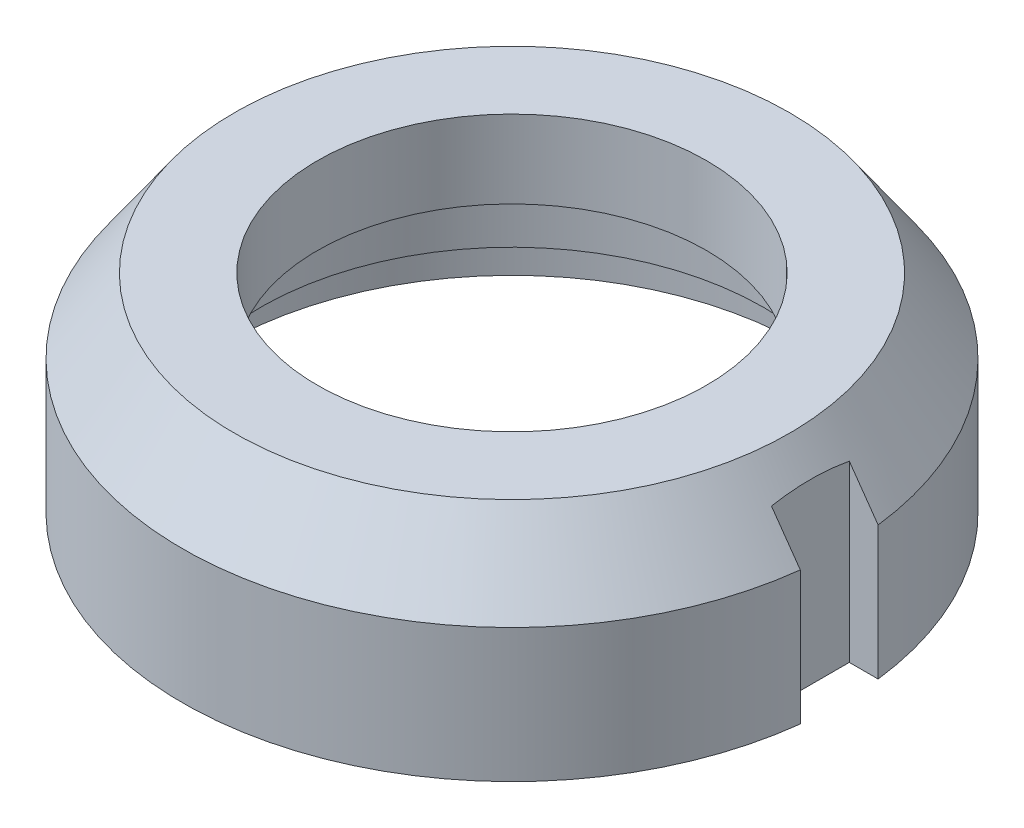
ISO-10303-21;
HEADER;
FILE_DESCRIPTION(('STEP AP214'),'2;1');
FILE_NAME('part.step','',(''),(''),'','','');
FILE_SCHEMA(('AUTOMOTIVE_DESIGN { 1 0 10303 214 1 1 1 1 }'));
ENDSEC;
DATA;
#1=APPLICATION_CONTEXT('core data for automotive mechanical design processes');
#2=APPLICATION_PROTOCOL_DEFINITION('international standard','automotive_design',2000,#1);
#3=PRODUCT_CONTEXT('',#1,'mechanical');
#4=PRODUCT('Part','Part','',(#3));
#5=PRODUCT_RELATED_PRODUCT_CATEGORY('part','',(#4));
#6=PRODUCT_DEFINITION_FORMATION('','',#4);
#7=PRODUCT_DEFINITION_CONTEXT('part definition',#1,'design');
#8=PRODUCT_DEFINITION('design','',#6,#7);
#9=PRODUCT_DEFINITION_SHAPE('','',#8);
#10=(LENGTH_UNIT() NAMED_UNIT(*) SI_UNIT(.MILLI.,.METRE.));
#11=(NAMED_UNIT(*) PLANE_ANGLE_UNIT() SI_UNIT($,.RADIAN.));
#12=(NAMED_UNIT(*) SI_UNIT($,.STERADIAN.) SOLID_ANGLE_UNIT());
#13=UNCERTAINTY_MEASURE_WITH_UNIT(LENGTH_MEASURE(1.E-05),#10,'distance_accuracy_value','');
#14=(GEOMETRIC_REPRESENTATION_CONTEXT(3) GLOBAL_UNCERTAINTY_ASSIGNED_CONTEXT((#13)) GLOBAL_UNIT_ASSIGNED_CONTEXT((#10,
#11,#12)) REPRESENTATION_CONTEXT('',''));
#15=CARTESIAN_POINT('',(0.,0.,0.));
#16=DIRECTION('',(0.,0.,1.));
#17=DIRECTION('',(1.,0.,0.));
#18=AXIS2_PLACEMENT_3D('',#15,#16,#17);
#19=CARTESIAN_POINT('',(-9.7,-1.99999999999995,0.));
#20=DIRECTION('',(0.,1.,0.));
#21=DIRECTION('',(0.,0.,1.));
#22=AXIS2_PLACEMENT_3D('',#19,#20,#21);
#23=PLANE('',#22);
#24=CARTESIAN_POINT('',(0.,-2.,0.));
#25=DIRECTION('',(0.,-1.,0.));
#26=DIRECTION('',(0.,0.,-1.));
#27=AXIS2_PLACEMENT_3D('',#24,#25,#26);
#28=CIRCLE('',#27,11.2);
#29=CARTESIAN_POINT('',(0.,-2.,-11.2));
#30=VERTEX_POINT('',#29);
#31=EDGE_CURVE('E960',#30,#30,#28,.T.);
#32=ORIENTED_EDGE('',*,*,#31,.F.);
#33=EDGE_LOOP('',(#32));
#34=FACE_BOUND('',#33,.T.);
#35=DIRECTION('',(-1.,0.,0.));
#36=VECTOR('',#35,1.);
#37=CARTESIAN_POINT('',(0.,-2.,1.50000000000006));
#38=LINE('',#37,#36);
#39=CARTESIAN_POINT('',(12.6111062163475,-2.,1.49999999999997));
#40=VERTEX_POINT('',#39);
#41=CARTESIAN_POINT('',(11.5,-2.00000000000006,1.49999999999999));
#42=VERTEX_POINT('',#41);
#43=EDGE_CURVE('E867',#40,#42,#38,.T.);
#44=ORIENTED_EDGE('',*,*,#43,.F.);
#45=CARTESIAN_POINT('',(0.,-2.,0.));
#46=DIRECTION('',(0.,-1.,0.));
#47=DIRECTION('',(0.,0.,-1.));
#48=AXIS2_PLACEMENT_3D('',#45,#46,#47);
#49=CIRCLE('',#48,12.7);
#50=CARTESIAN_POINT('',(-12.6111062163476,-2.00000000000006,1.50000000000003));
#51=VERTEX_POINT('',#50);
#52=EDGE_CURVE('E876',#40,#51,#49,.T.);
#53=ORIENTED_EDGE('',*,*,#52,.T.);
#54=DIRECTION('',(-1.,0.,0.));
#55=VECTOR('',#54,1.);
#56=CARTESIAN_POINT('',(0.,-2.,1.50000000000006));
#57=LINE('',#56,#55);
#58=CARTESIAN_POINT('',(-11.5,-2.00000000000006,1.49999999999995));
#59=VERTEX_POINT('',#58);
#60=EDGE_CURVE('E1132',#59,#51,#57,.T.);
#61=ORIENTED_EDGE('',*,*,#60,.F.);
#62=DIRECTION('',(0.,0.,1.));
#63=VECTOR('',#62,1.);
#64=CARTESIAN_POINT('',(-11.5,-2.00000000000006,0.));
#65=LINE('',#64,#63);
#66=CARTESIAN_POINT('',(-11.5,-2.00000000000006,-1.50000000000006));
#67=VERTEX_POINT('',#66);
#68=EDGE_CURVE('E1134',#67,#59,#65,.T.);
#69=ORIENTED_EDGE('',*,*,#68,.F.);
#70=DIRECTION('',(-1.,0.,0.));
#71=VECTOR('',#70,1.);
#72=CARTESIAN_POINT('',(0.,-2.,-1.5));
#73=LINE('',#72,#71);
#74=CARTESIAN_POINT('',(-12.6111062163476,-2.00000000000006,-1.49999999999993));
#75=VERTEX_POINT('',#74);
#76=EDGE_CURVE('E1125',#67,#75,#73,.T.);
#77=ORIENTED_EDGE('',*,*,#76,.T.);
#78=CARTESIAN_POINT('',(12.6111062163475,-1.99999999999995,-1.50000000000011));
#79=VERTEX_POINT('',#78);
#80=EDGE_CURVE('E884',#75,#79,#49,.T.);
#81=ORIENTED_EDGE('',*,*,#80,.T.);
#82=DIRECTION('',(-1.,0.,0.));
#83=VECTOR('',#82,1.);
#84=CARTESIAN_POINT('',(0.,-2.,-1.5));
#85=LINE('',#84,#83);
#86=CARTESIAN_POINT('',(11.5,-2.00000000000006,-1.49999999999997));
#87=VERTEX_POINT('',#86);
#88=EDGE_CURVE('E880',#79,#87,#85,.T.);
#89=ORIENTED_EDGE('',*,*,#88,.T.);
#90=DIRECTION('',(0.,0.,1.));
#91=VECTOR('',#90,1.);
#92=CARTESIAN_POINT('',(11.5,-1.99999999999995,0.));
#93=LINE('',#92,#91);
#94=EDGE_CURVE('E871',#87,#42,#93,.T.);
#95=ORIENTED_EDGE('',*,*,#94,.T.);
#96=EDGE_LOOP('',(#44,#53,#61,#69,#77,#81,#89,#95));
#97=FACE_BOUND('',#96,.T.);
#98=ADVANCED_FACE('F794',(#34,#97),#23,.F.);
#99=CARTESIAN_POINT('',(0.,0.,0.));
#100=DIRECTION('',(0.,-1.,0.));
#101=DIRECTION('',(0.,0.,-1.));
#102=AXIS2_PLACEMENT_3D('',#99,#100,#101);
#103=CYLINDRICAL_SURFACE('',#102,12.7);
#104=DIRECTION('',(0.,1.,0.));
#105=VECTOR('',#104,1.);
#106=CARTESIAN_POINT('',(12.6111062163475,-2.,1.49999999999997));
#107=LINE('',#106,#105);
#108=CARTESIAN_POINT('',(12.6111062163475,3.14370398651564,1.49999999999995));
#109=VERTEX_POINT('',#108);
#110=EDGE_CURVE('E863',#40,#109,#107,.T.);
#111=ORIENTED_EDGE('',*,*,#110,.T.);
#112=CARTESIAN_POINT('',(0.,3.14370398651564,0.));
#113=DIRECTION('',(0.,-1.,0.));
#114=DIRECTION('',(0.,0.,-1.));
#115=AXIS2_PLACEMENT_3D('',#112,#113,#114);
#116=CIRCLE('',#115,12.7);
#117=CARTESIAN_POINT('',(-12.6111062163476,3.14370398651559,1.49999999999992));
#118=VERTEX_POINT('',#117);
#119=EDGE_CURVE('E822',#109,#118,#116,.T.);
#120=ORIENTED_EDGE('',*,*,#119,.T.);
#121=DIRECTION('',(0.,1.,0.));
#122=VECTOR('',#121,1.);
#123=CARTESIAN_POINT('',(-12.6111062163476,-2.00000000000006,1.50000000000003));
#124=LINE('',#123,#122);
#125=EDGE_CURVE('E883',#51,#118,#124,.T.);
#126=ORIENTED_EDGE('',*,*,#125,.F.);
#127=ORIENTED_EDGE('',*,*,#52,.F.);
#128=EDGE_LOOP('',(#111,#120,#126,#127));
#129=FACE_BOUND('',#128,.T.);
#130=ADVANCED_FACE('F882',(#129),#103,.T.);
#131=CARTESIAN_POINT('',(0.,6.00000000000001,0.));
#132=DIRECTION('',(0.,-1.,0.));
#133=DIRECTION('',(0.,0.,-1.));
#134=AXIS2_PLACEMENT_3D('',#131,#132,#133);
#135=CONICAL_SURFACE('',#134,10.7,0.61086523819801);
#136=CARTESIAN_POINT('',(0.,6.00000000000001,0.));
#137=DIRECTION('',(0.,-1.,0.));
#138=DIRECTION('',(0.,0.,-1.));
#139=AXIS2_PLACEMENT_3D('',#136,#137,#138);
#140=CIRCLE('',#139,10.7);
#141=CARTESIAN_POINT('',(0.,6.00000000000001,-10.7));
#142=VERTEX_POINT('',#141);
#143=EDGE_CURVE('E981',#142,#142,#140,.T.);
#144=ORIENTED_EDGE('',*,*,#143,.T.);
#145=EDGE_LOOP('',(#144));
#146=FACE_BOUND('',#145,.T.);
#147=CARTESIAN_POINT('',(8.71930155160225,8.6458085640182,1.50000000000007));
#148=CARTESIAN_POINT('',(9.01503678715706,8.22955403382108,1.50000000000006));
#149=CARTESIAN_POINT('',(9.31049972115604,7.81310625233389,1.50000000000005));
#150=CARTESIAN_POINT('',(9.90099045107622,6.97990252734321,1.50000000000006));
#151=CARTESIAN_POINT('',(10.1960182471703,6.56314658396223,1.50000000000006));
#152=CARTESIAN_POINT('',(11.080612768889,5.31253452799819,1.50000000000005));
#153=CARTESIAN_POINT('',(11.66969133876,4.47833318799403,1.50000000000002));
#154=CARTESIAN_POINT('',(12.8470360584051,2.80935883936064,1.50000000000001));
#155=CARTESIAN_POINT('',(13.4353022089358,1.97458583126484,1.50000000000004));
#156=CARTESIAN_POINT('',(14.6112670019067,0.304638630112679,1.50000000000007));
#157=CARTESIAN_POINT('',(15.1989656436606,-0.530535563426971,1.50000000000006));
#158=CARTESIAN_POINT('',(15.7865020019929,-1.36582371112087,1.5));
#159=B_SPLINE_CURVE_WITH_KNOTS('',3,(#147,#148,#149,#150,#151,#152,#153,#154,#155,#156,#157,
#158),.UNSPECIFIED.,.F.,.F.,(4,2,2,2,2,4),(0.,1.53184312848382,3.06368564833025,
6.12736700345526,9.19104550377055,12.2547277041048),.UNSPECIFIED.);
#160=CARTESIAN_POINT('',(11.5,4.71836069197751,1.49999999999995));
#161=VERTEX_POINT('',#160);
#162=EDGE_CURVE('E12',#161,#109,#159,.T.);
#163=ORIENTED_EDGE('',*,*,#162,.F.);
#164=CARTESIAN_POINT('',(11.5,3.56892768957001,-4.64391354318697));
#165=CARTESIAN_POINT('',(11.5,3.71699253392862,-4.36697279316756));
#166=CARTESIAN_POINT('',(11.5,3.85640933601313,-4.08502379485564));
#167=CARTESIAN_POINT('',(11.5,4.1138093019548,-3.51036580472015));
#168=CARTESIAN_POINT('',(11.5,4.23171507029296,-3.21762234442898));
#169=CARTESIAN_POINT('',(11.5,4.43982888774233,-2.62548142835126));
#170=CARTESIAN_POINT('',(11.5,4.53029491793927,-2.32617625816735));
#171=CARTESIAN_POINT('',(11.5,4.68020785569034,-1.72020624485834));
#172=CARTESIAN_POINT('',(11.5,4.73970014134542,-1.41355286065126));
#173=CARTESIAN_POINT('',(11.5,4.8143076437408,-0.867244993862242));
#174=CARTESIAN_POINT('',(11.5,4.83651562925135,-0.628549392358913));
#175=CARTESIAN_POINT('',(11.5,4.85963108368953,-0.150067171071173));
#176=CARTESIAN_POINT('',(11.5,4.86053544038081,0.0897196030043449));
#177=CARTESIAN_POINT('',(11.5,4.84097009015225,0.56872858606512));
#178=CARTESIAN_POINT('',(11.5,4.82047189048171,0.807949616437833));
#179=CARTESIAN_POINT('',(11.5,4.75894551069299,1.2836708877918));
#180=CARTESIAN_POINT('',(11.5,4.71791937195211,1.52017139692033));
#181=CARTESIAN_POINT('',(11.5,4.60299147090772,2.05368333842938));
#182=CARTESIAN_POINT('',(11.5,4.52314638981536,2.34941522726641));
#183=CARTESIAN_POINT('',(11.5,4.33675688247403,2.93258796163586));
#184=CARTESIAN_POINT('',(11.5,4.23018009397359,3.2200182832448));
#185=CARTESIAN_POINT('',(11.5,3.99462828735819,3.78611703938219));
#186=CARTESIAN_POINT('',(11.5,3.8656069668218,4.06476592616495));
#187=CARTESIAN_POINT('',(11.5,3.58967866970254,4.61202415300142));
#188=CARTESIAN_POINT('',(11.5,3.44282838729327,4.88066194172413));
#189=CARTESIAN_POINT('',(11.5,3.28882508825268,5.14483307749156));
#190=B_SPLINE_CURVE_WITH_KNOTS('',3,(#164,#165,#166,#167,#168,#169,#170,#171,#172,#173,#174,
#175,#176,#177,#178,#179,#180,#181,#182,#183,#184,#185,#186,#187,#188,#189),.UNSPECIFIED.,.F.,
.F.,(4,2,2,2,2,2,2,2,2,2,2,2,4),(0.,0.942469163857526,1.88826513948544,2.82487174549635,
3.76010228660609,4.47839270624487,5.19678805991632,5.91614101836075,6.63542245578983,
7.55286443638359,8.47142250794333,9.39189851057672,10.3095206068161),.UNSPECIFIED.);
#191=CARTESIAN_POINT('',(11.5,4.71836069197756,-1.50000000000002));
#192=VERTEX_POINT('',#191);
#193=EDGE_CURVE('E807',#161,#192,#190,.F.);
#194=ORIENTED_EDGE('',*,*,#193,.T.);
#195=CARTESIAN_POINT('',(8.71930155160225,8.64580856401831,-1.49999999999999));
#196=CARTESIAN_POINT('',(9.01503678715704,8.22955403382117,-1.5));
#197=CARTESIAN_POINT('',(9.310499721156,7.81310625233397,-1.5));
#198=CARTESIAN_POINT('',(9.90099045107618,6.97990252734328,-1.50000000000001));
#199=CARTESIAN_POINT('',(10.1960182471702,6.56314658396229,-1.5));
#200=CARTESIAN_POINT('',(11.080612768889,5.31253452799825,-1.5));
#201=CARTESIAN_POINT('',(11.66969133876,4.47833318799409,-1.5));
#202=CARTESIAN_POINT('',(12.8470360584051,2.80935883936068,-1.5));
#203=CARTESIAN_POINT('',(13.4353022089358,1.97458583126486,-1.5));
#204=CARTESIAN_POINT('',(14.6112670019067,0.304638630112664,-1.50000000000001));
#205=CARTESIAN_POINT('',(15.1989656436606,-0.530535563427008,-1.50000000000002));
#206=CARTESIAN_POINT('',(15.7865020019929,-1.36582371112093,-1.50000000000004));
#207=B_SPLINE_CURVE_WITH_KNOTS('',3,(#195,#196,#197,#198,#199,#200,#201,#202,#203,#204,#205,
#206),.UNSPECIFIED.,.F.,.F.,(4,2,2,2,2,4),(0.,1.53184312848383,3.06368564833027,6.1273670034553,
9.19104550377064,12.2547277041049),.UNSPECIFIED.);
#208=CARTESIAN_POINT('',(12.6111062163475,3.14370398651576,-1.49999999999999));
#209=VERTEX_POINT('',#208);
#210=EDGE_CURVE('E930',#192,#209,#207,.T.);
#211=ORIENTED_EDGE('',*,*,#210,.T.);
#212=CARTESIAN_POINT('',(-12.6111062163476,3.14370398651564,-1.49999999999999));
#213=VERTEX_POINT('',#212);
#214=EDGE_CURVE('E885',#213,#209,#116,.T.);
#215=ORIENTED_EDGE('',*,*,#214,.F.);
#216=CARTESIAN_POINT('',(-15.7865020019929,-1.36582371112098,-1.50000000000004));
#217=CARTESIAN_POINT('',(-15.1989656436606,-0.530535563427032,-1.50000000000002));
#218=CARTESIAN_POINT('',(-14.6112670019067,0.30463863011263,-1.50000000000001));
#219=CARTESIAN_POINT('',(-13.4353022089359,1.97458583126479,-1.5));
#220=CARTESIAN_POINT('',(-12.8470360584051,2.80935883936058,-1.5));
#221=CARTESIAN_POINT('',(-11.66969133876,4.47833318799398,-1.5));
#222=CARTESIAN_POINT('',(-11.080612768889,5.31253452799816,-1.5));
#223=CARTESIAN_POINT('',(-10.1960182471703,6.56314658396221,-1.5));
#224=CARTESIAN_POINT('',(-9.90099045107625,6.9799025273432,-1.5));
#225=CARTESIAN_POINT('',(-9.31049972115606,7.81310625233389,-1.5));
#226=CARTESIAN_POINT('',(-9.01503678715708,8.22955403382108,-1.5));
#227=CARTESIAN_POINT('',(-8.71930155160226,8.6458085640182,-1.49999999999999));
#228=B_SPLINE_CURVE_WITH_KNOTS('',3,(#216,#217,#218,#219,#220,#221,#222,#223,#224,#225,#226,
#227),.UNSPECIFIED.,.F.,.F.,(4,2,2,2,2,4),(0.,3.06368220033422,6.12736070064952,
9.19104205577455,10.722884575621,12.2547277041048),.UNSPECIFIED.);
#229=CARTESIAN_POINT('',(-11.5,4.71836069197745,-1.5));
#230=VERTEX_POINT('',#229);
#231=EDGE_CURVE('E923',#213,#230,#228,.T.);
#232=ORIENTED_EDGE('',*,*,#231,.T.);
#233=CARTESIAN_POINT('',(-11.5,3.5689276895699,-4.64391354318709));
#234=CARTESIAN_POINT('',(-11.5,3.71699253392853,-4.36697279316768));
#235=CARTESIAN_POINT('',(-11.5,3.85640933601306,-4.08502379485574));
#236=CARTESIAN_POINT('',(-11.5,4.11380930195475,-3.51036580472023));
#237=CARTESIAN_POINT('',(-11.5,4.23171507029292,-3.21762234442904));
#238=CARTESIAN_POINT('',(-11.5,4.4398288877423,-2.62548142835129));
#239=CARTESIAN_POINT('',(-11.5,4.53029491793924,-2.32617625816737));
#240=CARTESIAN_POINT('',(-11.5,4.68020785569033,-1.72020624485834));
#241=CARTESIAN_POINT('',(-11.5,4.73970014134542,-1.41355286065124));
#242=CARTESIAN_POINT('',(-11.5,4.81430764374079,-0.867244993862214));
#243=CARTESIAN_POINT('',(-11.5,4.83651562925134,-0.628549392358883));
#244=CARTESIAN_POINT('',(-11.5,4.8596310836895,-0.150067171071141));
#245=CARTESIAN_POINT('',(-11.5,4.86053544038079,0.0897196030043775));
#246=CARTESIAN_POINT('',(-11.5,4.84097009015223,0.568728586065156));
#247=CARTESIAN_POINT('',(-11.5,4.82047189048169,0.807949616437873));
#248=CARTESIAN_POINT('',(-11.5,4.75894551069295,1.28367088779184));
#249=CARTESIAN_POINT('',(-11.5,4.71791937195206,1.52017139692037));
#250=CARTESIAN_POINT('',(-11.5,4.60299147090766,2.05368333842942));
#251=CARTESIAN_POINT('',(-11.5,4.52314638981532,2.34941522726644));
#252=CARTESIAN_POINT('',(-11.5,4.33675688247401,2.93258796163588));
#253=CARTESIAN_POINT('',(-11.5,4.23018009397357,3.22001828324482));
#254=CARTESIAN_POINT('',(-11.5,3.99462828735817,3.78611703938219));
#255=CARTESIAN_POINT('',(-11.5,3.86560696682177,4.06476592616494));
#256=CARTESIAN_POINT('',(-11.5,3.58967866970254,4.6120241530014));
#257=CARTESIAN_POINT('',(-11.5,3.44282838729329,4.88066194172411));
#258=CARTESIAN_POINT('',(-11.5,3.28882508825273,5.14483307749154));
#259=B_SPLINE_CURVE_WITH_KNOTS('',3,(#233,#234,#235,#236,#237,#238,#239,#240,#241,#242,#243,
#244,#245,#246,#247,#248,#249,#250,#251,#252,#253,#254,#255,#256,#257,#258),.UNSPECIFIED.,.F.,
.F.,(4,2,2,2,2,2,2,2,2,2,2,2,4),(0.,0.942469163857574,1.88826513948554,2.82487174549649,
3.76010228660627,4.47839270624505,5.19678805991651,5.91614101836094,6.63542245579003,
7.55286443638377,8.47142250794349,9.39189851057685,10.3095206068162),.UNSPECIFIED.);
#260=CARTESIAN_POINT('',(-11.5,4.71836069197751,1.49999999999996));
#261=VERTEX_POINT('',#260);
#262=EDGE_CURVE('E899',#261,#230,#259,.F.);
#263=ORIENTED_EDGE('',*,*,#262,.F.);
#264=CARTESIAN_POINT('',(-15.7865020019929,-1.36582371112098,1.49999999999999));
#265=CARTESIAN_POINT('',(-15.1989656436606,-0.530535563427045,1.5000000000001));
#266=CARTESIAN_POINT('',(-14.6112670019067,0.30463863011263,1.50000000000009));
#267=CARTESIAN_POINT('',(-13.4353022089359,1.97458583126482,1.50000000000002));
#268=CARTESIAN_POINT('',(-12.8470360584051,2.80935883936063,1.49999999999996));
#269=CARTESIAN_POINT('',(-11.66969133876,4.47833318799402,1.49999999999996));
#270=CARTESIAN_POINT('',(-11.080612768889,5.31253452799817,1.50000000000003));
#271=CARTESIAN_POINT('',(-10.1960182471703,6.5631465839622,1.50000000000007));
#272=CARTESIAN_POINT('',(-9.90099045107624,6.97990252734319,1.50000000000007));
#273=CARTESIAN_POINT('',(-9.31049972115606,7.81310625233386,1.50000000000004));
#274=CARTESIAN_POINT('',(-9.01503678715708,8.22955403382104,1.50000000000002));
#275=CARTESIAN_POINT('',(-8.71930155160226,8.64580856401814,1.49999999999999));
#276=B_SPLINE_CURVE_WITH_KNOTS('',3,(#264,#265,#266,#267,#268,#269,#270,#271,#272,#273,#274,
#275),.UNSPECIFIED.,.F.,.F.,(4,2,2,2,2,4),(0.,3.06368220033424,6.12736070064956,
9.19104205577455,10.722884575621,12.2547277041048),.UNSPECIFIED.);
#277=EDGE_CURVE('E888',#118,#261,#276,.T.);
#278=ORIENTED_EDGE('',*,*,#277,.F.);
#279=ORIENTED_EDGE('',*,*,#119,.F.);
#280=EDGE_LOOP('',(#163,#194,#211,#215,#232,#263,#278,#279));
#281=FACE_BOUND('',#280,.T.);
#282=ADVANCED_FACE('F906',(#146,#281),#135,.T.);
#283=CARTESIAN_POINT('',(0.,0.,0.));
#284=DIRECTION('',(0.,-1.,0.));
#285=DIRECTION('',(0.,0.,-1.));
#286=AXIS2_PLACEMENT_3D('',#283,#284,#285);
#287=CYLINDRICAL_SURFACE('',#286,9.7);
#288=CARTESIAN_POINT('',(0.,3.,0.));
#289=DIRECTION('',(0.,-1.,0.));
#290=DIRECTION('',(0.,0.,-1.));
#291=AXIS2_PLACEMENT_3D('',#288,#289,#290);
#292=CIRCLE('',#291,9.7);
#293=CARTESIAN_POINT('',(0.,3.,-9.70000000000001));
#294=VERTEX_POINT('',#293);
#295=EDGE_CURVE('E973',#294,#294,#292,.T.);
#296=ORIENTED_EDGE('',*,*,#295,.F.);
#297=EDGE_LOOP('',(#296));
#298=FACE_BOUND('',#297,.T.);
#299=CARTESIAN_POINT('',(0.,0.,0.));
#300=DIRECTION('',(0.,-1.,0.));
#301=DIRECTION('',(0.,0.,-1.));
#302=AXIS2_PLACEMENT_3D('',#299,#300,#301);
#303=CIRCLE('',#302,9.7);
#304=CARTESIAN_POINT('',(0.,0.,-9.70000000000001));
#305=VERTEX_POINT('',#304);
#306=EDGE_CURVE('E962',#305,#305,#303,.F.);
#307=ORIENTED_EDGE('',*,*,#306,.F.);
#308=EDGE_LOOP('',(#307));
#309=FACE_BOUND('',#308,.T.);
#310=ADVANCED_FACE('F1005',(#298,#309),#287,.F.);
#311=ORIENTED_EDGE('',*,*,#214,.T.);
#312=DIRECTION('',(0.,1.,0.));
#313=VECTOR('',#312,1.);
#314=CARTESIAN_POINT('',(12.6111062163475,-1.99999999999995,-1.50000000000011));
#315=LINE('',#314,#313);
#316=EDGE_CURVE('E814',#79,#209,#315,.T.);
#317=ORIENTED_EDGE('',*,*,#316,.F.);
#318=ORIENTED_EDGE('',*,*,#80,.F.);
#319=DIRECTION('',(0.,1.,0.));
#320=VECTOR('',#319,1.);
#321=CARTESIAN_POINT('',(-12.6111062163476,-2.00000000000006,-1.49999999999993));
#322=LINE('',#321,#320);
#323=EDGE_CURVE('E1118',#75,#213,#322,.T.);
#324=ORIENTED_EDGE('',*,*,#323,.T.);
#325=EDGE_LOOP('',(#311,#317,#318,#324));
#326=FACE_BOUND('',#325,.T.);
#327=ADVANCED_FACE('F957',(#326),#103,.T.);
#328=CARTESIAN_POINT('',(-7.5,6.00000000000001,0.));
#329=DIRECTION('',(0.,-1.,0.));
#330=DIRECTION('',(0.,0.,-1.));
#331=AXIS2_PLACEMENT_3D('',#328,#329,#330);
#332=PLANE('',#331);
#333=ORIENTED_EDGE('',*,*,#143,.F.);
#334=EDGE_LOOP('',(#333));
#335=FACE_BOUND('',#334,.T.);
#336=CARTESIAN_POINT('',(0.,6.00000000000001,0.));
#337=DIRECTION('',(0.,-1.,0.));
#338=DIRECTION('',(0.,0.,-1.));
#339=AXIS2_PLACEMENT_3D('',#336,#337,#338);
#340=CIRCLE('',#339,7.5);
#341=CARTESIAN_POINT('',(0.,6.00000000000001,-7.50000000000004));
#342=VERTEX_POINT('',#341);
#343=EDGE_CURVE('E979',#342,#342,#340,.T.);
#344=ORIENTED_EDGE('',*,*,#343,.T.);
#345=EDGE_LOOP('',(#344));
#346=FACE_BOUND('',#345,.T.);
#347=ADVANCED_FACE('F987',(#335,#346),#332,.F.);
#348=CARTESIAN_POINT('',(0.,0.,0.));
#349=DIRECTION('',(0.,-1.,0.));
#350=DIRECTION('',(0.,0.,-1.));
#351=AXIS2_PLACEMENT_3D('',#348,#349,#350);
#352=CYLINDRICAL_SURFACE('',#351,7.5);
#353=ORIENTED_EDGE('',*,*,#343,.F.);
#354=EDGE_LOOP('',(#353));
#355=FACE_BOUND('',#354,.T.);
#356=CARTESIAN_POINT('',(0.,3.,0.));
#357=DIRECTION('',(0.,-1.,0.));
#358=DIRECTION('',(0.,0.,-1.));
#359=AXIS2_PLACEMENT_3D('',#356,#357,#358);
#360=CIRCLE('',#359,7.5);
#361=CARTESIAN_POINT('',(0.,3.,-7.50000000000001));
#362=VERTEX_POINT('',#361);
#363=EDGE_CURVE('E976',#362,#362,#360,.T.);
#364=ORIENTED_EDGE('',*,*,#363,.T.);
#365=EDGE_LOOP('',(#364));
#366=FACE_BOUND('',#365,.T.);
#367=ADVANCED_FACE('F990',(#355,#366),#352,.F.);
#368=CARTESIAN_POINT('',(-9.7,2.99999999999995,0.));
#369=DIRECTION('',(0.,1.,0.));
#370=DIRECTION('',(0.,0.,1.));
#371=AXIS2_PLACEMENT_3D('',#368,#369,#370);
#372=PLANE('',#371);
#373=ORIENTED_EDGE('',*,*,#363,.F.);
#374=EDGE_LOOP('',(#373));
#375=FACE_BOUND('',#374,.T.);
#376=ORIENTED_EDGE('',*,*,#295,.T.);
#377=EDGE_LOOP('',(#376));
#378=FACE_BOUND('',#377,.T.);
#379=ADVANCED_FACE('F995',(#375,#378),#372,.F.);
#380=CARTESIAN_POINT('',(0.,0.,0.));
#381=DIRECTION('',(0.,-1.,0.));
#382=DIRECTION('',(0.,0.,-1.));
#383=AXIS2_PLACEMENT_3D('',#380,#381,#382);
#384=CYLINDRICAL_SURFACE('',#383,11.2);
#385=CARTESIAN_POINT('',(0.,0.,0.));
#386=DIRECTION('',(0.,-1.,0.));
#387=DIRECTION('',(0.,0.,-1.));
#388=AXIS2_PLACEMENT_3D('',#385,#386,#387);
#389=CIRCLE('',#388,11.2);
#390=CARTESIAN_POINT('',(0.,0.,-11.2));
#391=VERTEX_POINT('',#390);
#392=EDGE_CURVE('E966',#391,#391,#389,.T.);
#393=ORIENTED_EDGE('',*,*,#392,.F.);
#394=EDGE_LOOP('',(#393));
#395=FACE_BOUND('',#394,.T.);
#396=ORIENTED_EDGE('',*,*,#31,.T.);
#397=EDGE_LOOP('',(#396));
#398=FACE_BOUND('',#397,.T.);
#399=ADVANCED_FACE('F1001',(#395,#398),#384,.F.);
#400=CARTESIAN_POINT('',(0.,0.,0.));
#401=DIRECTION('',(0.,-1.,0.));
#402=DIRECTION('',(0.,0.,-1.));
#403=AXIS2_PLACEMENT_3D('',#400,#401,#402);
#404=PLANE('',#403);
#405=ORIENTED_EDGE('',*,*,#306,.T.);
#406=EDGE_LOOP('',(#405));
#407=FACE_BOUND('',#406,.T.);
#408=ORIENTED_EDGE('',*,*,#392,.T.);
#409=EDGE_LOOP('',(#408));
#410=FACE_BOUND('',#409,.T.);
#411=ADVANCED_FACE('F920',(#407,#410),#404,.T.);
#412=CARTESIAN_POINT('',(0.,-2.,-1.5));
#413=DIRECTION('',(0.,0.,-1.));
#414=DIRECTION('',(-1.,0.,0.));
#415=AXIS2_PLACEMENT_3D('',#412,#413,#414);
#416=PLANE('',#415);
#417=ORIENTED_EDGE('',*,*,#323,.F.);
#418=ORIENTED_EDGE('',*,*,#76,.F.);
#419=DIRECTION('',(0.,1.,0.));
#420=VECTOR('',#419,1.);
#421=CARTESIAN_POINT('',(-11.5,-2.00000000000006,-1.50000000000006));
#422=LINE('',#421,#420);
#423=EDGE_CURVE('E963',#67,#230,#422,.T.);
#424=ORIENTED_EDGE('',*,*,#423,.T.);
#425=ORIENTED_EDGE('',*,*,#231,.F.);
#426=EDGE_LOOP('',(#417,#418,#424,#425));
#427=FACE_BOUND('',#426,.T.);
#428=ADVANCED_FACE('F916',(#427),#416,.F.);
#429=CARTESIAN_POINT('',(-11.5,-2.00000000000006,0.));
#430=DIRECTION('',(-1.,0.,0.));
#431=DIRECTION('',(0.,0.,1.));
#432=AXIS2_PLACEMENT_3D('',#429,#430,#431);
#433=PLANE('',#432);
#434=ORIENTED_EDGE('',*,*,#262,.T.);
#435=ORIENTED_EDGE('',*,*,#423,.F.);
#436=ORIENTED_EDGE('',*,*,#68,.T.);
#437=DIRECTION('',(0.,1.,0.));
#438=VECTOR('',#437,1.);
#439=CARTESIAN_POINT('',(-11.5,-2.00000000000006,1.49999999999995));
#440=LINE('',#439,#438);
#441=EDGE_CURVE('E969',#59,#261,#440,.T.);
#442=ORIENTED_EDGE('',*,*,#441,.T.);
#443=EDGE_LOOP('',(#434,#435,#436,#442));
#444=FACE_BOUND('',#443,.T.);
#445=ADVANCED_FACE('F913',(#444),#433,.T.);
#446=CARTESIAN_POINT('',(0.,-2.,1.50000000000006));
#447=DIRECTION('',(0.,0.,-1.));
#448=DIRECTION('',(-1.,0.,0.));
#449=AXIS2_PLACEMENT_3D('',#446,#447,#448);
#450=PLANE('',#449);
#451=ORIENTED_EDGE('',*,*,#277,.T.);
#452=ORIENTED_EDGE('',*,*,#441,.F.);
#453=ORIENTED_EDGE('',*,*,#60,.T.);
#454=ORIENTED_EDGE('',*,*,#125,.T.);
#455=EDGE_LOOP('',(#451,#452,#453,#454));
#456=FACE_BOUND('',#455,.T.);
#457=ADVANCED_FACE('F909',(#456),#450,.T.);
#458=CARTESIAN_POINT('',(0.,-2.,1.50000000000006));
#459=DIRECTION('',(0.,0.,-1.));
#460=DIRECTION('',(-1.,0.,0.));
#461=AXIS2_PLACEMENT_3D('',#458,#459,#460);
#462=PLANE('',#461);
#463=ORIENTED_EDGE('',*,*,#162,.T.);
#464=ORIENTED_EDGE('',*,*,#110,.F.);
#465=ORIENTED_EDGE('',*,*,#43,.T.);
#466=DIRECTION('',(0.,1.,0.));
#467=VECTOR('',#466,1.);
#468=CARTESIAN_POINT('',(11.5,-2.00000000000006,1.49999999999999));
#469=LINE('',#468,#467);
#470=EDGE_CURVE('E1123',#42,#161,#469,.T.);
#471=ORIENTED_EDGE('',*,*,#470,.T.);
#472=EDGE_LOOP('',(#463,#464,#465,#471));
#473=FACE_BOUND('',#472,.T.);
#474=ADVANCED_FACE('F865',(#473),#462,.T.);
#475=CARTESIAN_POINT('',(11.5,-1.99999999999995,0.));
#476=DIRECTION('',(-1.,0.,0.));
#477=DIRECTION('',(0.,0.,1.));
#478=AXIS2_PLACEMENT_3D('',#475,#476,#477);
#479=PLANE('',#478);
#480=ORIENTED_EDGE('',*,*,#470,.F.);
#481=ORIENTED_EDGE('',*,*,#94,.F.);
#482=DIRECTION('',(0.,1.,0.));
#483=VECTOR('',#482,1.);
#484=CARTESIAN_POINT('',(11.5,-2.00000000000006,-1.49999999999997));
#485=LINE('',#484,#483);
#486=EDGE_CURVE('E1122',#87,#192,#485,.T.);
#487=ORIENTED_EDGE('',*,*,#486,.T.);
#488=ORIENTED_EDGE('',*,*,#193,.F.);
#489=EDGE_LOOP('',(#480,#481,#487,#488));
#490=FACE_BOUND('',#489,.T.);
#491=ADVANCED_FACE('F944',(#490),#479,.F.);
#492=CARTESIAN_POINT('',(0.,-2.,-1.5));
#493=DIRECTION('',(0.,0.,-1.));
#494=DIRECTION('',(-1.,0.,0.));
#495=AXIS2_PLACEMENT_3D('',#492,#493,#494);
#496=PLANE('',#495);
#497=ORIENTED_EDGE('',*,*,#486,.F.);
#498=ORIENTED_EDGE('',*,*,#88,.F.);
#499=ORIENTED_EDGE('',*,*,#316,.T.);
#500=ORIENTED_EDGE('',*,*,#210,.F.);
#501=EDGE_LOOP('',(#497,#498,#499,#500));
#502=FACE_BOUND('',#501,.T.);
#503=ADVANCED_FACE('F941',(#502),#496,.F.);
#504=CLOSED_SHELL('',(#98,#130,#282,#310,#327,#347,#367,#379,#399,#411,#428,#445,#457,#474,#491,#503));
#505=MANIFOLD_SOLID_BREP('B2',#504);
#506=ADVANCED_BREP_SHAPE_REPRESENTATION('',(#18,#505),#14);
#507=SHAPE_DEFINITION_REPRESENTATION(#9,#506);
ENDSEC;
END-ISO-10303-21;
